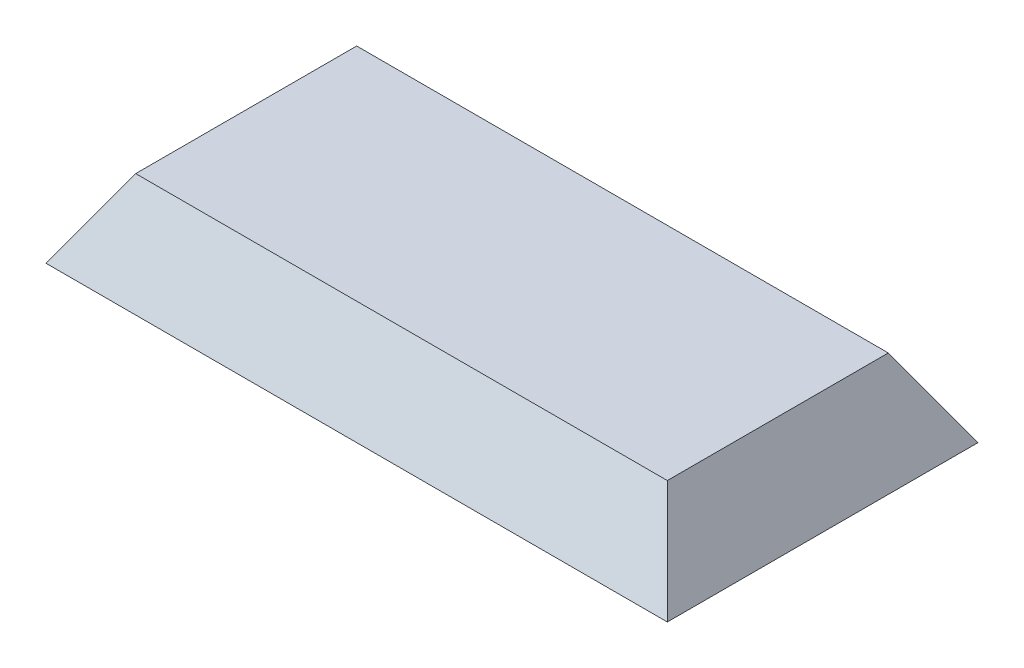
ISO-10303-21;
HEADER;
FILE_DESCRIPTION(('STEP AP214'),'2;1');
FILE_NAME('part.step','',(''),(''),'','','');
FILE_SCHEMA(('AUTOMOTIVE_DESIGN { 1 0 10303 214 1 1 1 1 }'));
ENDSEC;
DATA;
#1=APPLICATION_CONTEXT('core data for automotive mechanical design processes');
#2=APPLICATION_PROTOCOL_DEFINITION('international standard','automotive_design',2000,#1);
#3=PRODUCT_CONTEXT('',#1,'mechanical');
#4=PRODUCT('Part','Part','',(#3));
#5=PRODUCT_RELATED_PRODUCT_CATEGORY('part','',(#4));
#6=PRODUCT_DEFINITION_FORMATION('','',#4);
#7=PRODUCT_DEFINITION_CONTEXT('part definition',#1,'design');
#8=PRODUCT_DEFINITION('design','',#6,#7);
#9=PRODUCT_DEFINITION_SHAPE('','',#8);
#10=(LENGTH_UNIT() NAMED_UNIT(*) SI_UNIT(.MILLI.,.METRE.));
#11=(NAMED_UNIT(*) PLANE_ANGLE_UNIT() SI_UNIT($,.RADIAN.));
#12=(NAMED_UNIT(*) SI_UNIT($,.STERADIAN.) SOLID_ANGLE_UNIT());
#13=UNCERTAINTY_MEASURE_WITH_UNIT(LENGTH_MEASURE(1.E-05),#10,'distance_accuracy_value','');
#14=(GEOMETRIC_REPRESENTATION_CONTEXT(3) GLOBAL_UNCERTAINTY_ASSIGNED_CONTEXT((#13)) GLOBAL_UNIT_ASSIGNED_CONTEXT((#10,
#11,#12)) REPRESENTATION_CONTEXT('',''));
#15=CARTESIAN_POINT('',(0.,0.,0.));
#16=DIRECTION('',(0.,0.,1.));
#17=DIRECTION('',(1.,0.,0.));
#18=AXIS2_PLACEMENT_3D('',#15,#16,#17);
#19=CARTESIAN_POINT('',(40.,0.,20.));
#20=DIRECTION('',(0.866025403784438,0.5,0.));
#21=DIRECTION('',(-0.5,0.866025403784438,0.));
#22=AXIS2_PLACEMENT_3D('',#19,#20,#21);
#23=PLANE('',#22);
#24=DIRECTION('',(0.,0.,-1.));
#25=VECTOR('',#24,1.);
#26=CARTESIAN_POINT('',(40.,0.,20.));
#27=LINE('',#26,#25);
#28=CARTESIAN_POINT('',(40.,0.,20.));
#29=VERTEX_POINT('',#28);
#30=CARTESIAN_POINT('',(40.,0.,-20.));
#31=VERTEX_POINT('',#30);
#32=EDGE_CURVE('E79',#29,#31,#27,.T.);
#33=ORIENTED_EDGE('',*,*,#32,.T.);
#34=DIRECTION('',(0.447213595499958,-0.774596669241483,-0.447213595499958));
#35=VECTOR('',#34,1.);
#36=CARTESIAN_POINT('',(24.,27.712812921102,-3.99999999999998));
#37=LINE('',#36,#35);
#38=CARTESIAN_POINT('',(34.2264973081037,10.,-14.2264973081037));
#39=VERTEX_POINT('',#38);
#40=EDGE_CURVE('E11',#39,#31,#37,.T.);
#41=ORIENTED_EDGE('',*,*,#40,.F.);
#42=DIRECTION('',(0.,0.,1.));
#43=VECTOR('',#42,1.);
#44=CARTESIAN_POINT('',(34.2264973081037,10.,0.));
#45=LINE('',#44,#43);
#46=CARTESIAN_POINT('',(34.2264973081037,10.,14.2264973081037));
#47=VERTEX_POINT('',#46);
#48=EDGE_CURVE('E95',#47,#39,#45,.F.);
#49=ORIENTED_EDGE('',*,*,#48,.F.);
#50=DIRECTION('',(0.447213595499958,-0.774596669241483,0.447213595499958));
#51=VECTOR('',#50,1.);
#52=CARTESIAN_POINT('',(40.,0.,20.));
#53=LINE('',#52,#51);
#54=EDGE_CURVE('E90',#47,#29,#53,.T.);
#55=ORIENTED_EDGE('',*,*,#54,.T.);
#56=EDGE_LOOP('',(#33,#41,#49,#55));
#57=FACE_BOUND('',#56,.T.);
#58=ADVANCED_FACE('F33',(#57),#23,.T.);
#59=CARTESIAN_POINT('',(-40.,0.,-20.));
#60=DIRECTION('',(0.,0.5,-0.866025403784438));
#61=DIRECTION('',(0.,0.866025403784438,0.5));
#62=AXIS2_PLACEMENT_3D('',#59,#60,#61);
#63=PLANE('',#62);
#64=DIRECTION('',(-1.,0.,0.));
#65=VECTOR('',#64,1.);
#66=CARTESIAN_POINT('',(-40.,0.,-20.));
#67=LINE('',#66,#65);
#68=CARTESIAN_POINT('',(-40.,0.,-20.));
#69=VERTEX_POINT('',#68);
#70=EDGE_CURVE('E75',#31,#69,#67,.T.);
#71=ORIENTED_EDGE('',*,*,#70,.T.);
#72=DIRECTION('',(-0.447213595499958,-0.774596669241483,-0.447213595499958));
#73=VECTOR('',#72,1.);
#74=CARTESIAN_POINT('',(-32.,13.856406460551,-12.));
#75=LINE('',#74,#73);
#76=CARTESIAN_POINT('',(-34.2264973081037,10.,-14.2264973081037));
#77=VERTEX_POINT('',#76);
#78=EDGE_CURVE('E42',#77,#69,#75,.T.);
#79=ORIENTED_EDGE('',*,*,#78,.F.);
#80=DIRECTION('',(1.,0.,0.));
#81=VECTOR('',#80,1.);
#82=CARTESIAN_POINT('',(0.,10.,-14.2264973081037));
#83=LINE('',#82,#81);
#84=EDGE_CURVE('E86',#39,#77,#83,.F.);
#85=ORIENTED_EDGE('',*,*,#84,.F.);
#86=ORIENTED_EDGE('',*,*,#40,.T.);
#87=EDGE_LOOP('',(#71,#79,#85,#86));
#88=FACE_BOUND('',#87,.T.);
#89=ADVANCED_FACE('F35',(#88),#63,.T.);
#90=CARTESIAN_POINT('',(-40.,0.,20.));
#91=DIRECTION('',(-0.866025403784438,0.5,0.));
#92=DIRECTION('',(-0.5,-0.866025403784438,0.));
#93=AXIS2_PLACEMENT_3D('',#90,#91,#92);
#94=PLANE('',#93);
#95=DIRECTION('',(0.,0.,1.));
#96=VECTOR('',#95,1.);
#97=CARTESIAN_POINT('',(-40.,0.,20.));
#98=LINE('',#97,#96);
#99=CARTESIAN_POINT('',(-40.,0.,20.));
#100=VERTEX_POINT('',#99);
#101=EDGE_CURVE('E80',#69,#100,#98,.T.);
#102=ORIENTED_EDGE('',*,*,#101,.T.);
#103=DIRECTION('',(-0.447213595499958,-0.774596669241483,0.447213595499958));
#104=VECTOR('',#103,1.);
#105=CARTESIAN_POINT('',(-40.,0.,20.));
#106=LINE('',#105,#104);
#107=CARTESIAN_POINT('',(-34.2264973081037,10.,14.2264973081037));
#108=VERTEX_POINT('',#107);
#109=EDGE_CURVE('E98',#108,#100,#106,.T.);
#110=ORIENTED_EDGE('',*,*,#109,.F.);
#111=DIRECTION('',(0.,0.,-1.));
#112=VECTOR('',#111,1.);
#113=CARTESIAN_POINT('',(-34.2264973081037,10.,0.));
#114=LINE('',#113,#112);
#115=EDGE_CURVE('E54',#77,#108,#114,.F.);
#116=ORIENTED_EDGE('',*,*,#115,.F.);
#117=ORIENTED_EDGE('',*,*,#78,.T.);
#118=EDGE_LOOP('',(#102,#110,#116,#117));
#119=FACE_BOUND('',#118,.T.);
#120=ADVANCED_FACE('F105',(#119),#94,.T.);
#121=CARTESIAN_POINT('',(-40.,0.,20.));
#122=DIRECTION('',(0.,0.5,0.866025403784438));
#123=DIRECTION('',(0.,-0.866025403784438,0.5));
#124=AXIS2_PLACEMENT_3D('',#121,#122,#123);
#125=PLANE('',#124);
#126=DIRECTION('',(1.,0.,0.));
#127=VECTOR('',#126,1.);
#128=CARTESIAN_POINT('',(-40.,0.,20.));
#129=LINE('',#128,#127);
#130=EDGE_CURVE('E94',#100,#29,#129,.T.);
#131=ORIENTED_EDGE('',*,*,#130,.T.);
#132=ORIENTED_EDGE('',*,*,#54,.F.);
#133=DIRECTION('',(-1.,0.,0.));
#134=VECTOR('',#133,1.);
#135=CARTESIAN_POINT('',(0.,10.,14.2264973081037));
#136=LINE('',#135,#134);
#137=EDGE_CURVE('E37',#108,#47,#136,.F.);
#138=ORIENTED_EDGE('',*,*,#137,.F.);
#139=ORIENTED_EDGE('',*,*,#109,.T.);
#140=EDGE_LOOP('',(#131,#132,#138,#139));
#141=FACE_BOUND('',#140,.T.);
#142=ADVANCED_FACE('F107',(#141),#125,.T.);
#143=CARTESIAN_POINT('',(0.,10.,0.));
#144=DIRECTION('',(0.,-1.,0.));
#145=DIRECTION('',(0.,0.,-1.));
#146=AXIS2_PLACEMENT_3D('',#143,#144,#145);
#147=PLANE('',#146);
#148=ORIENTED_EDGE('',*,*,#48,.T.);
#149=ORIENTED_EDGE('',*,*,#84,.T.);
#150=ORIENTED_EDGE('',*,*,#115,.T.);
#151=ORIENTED_EDGE('',*,*,#137,.T.);
#152=EDGE_LOOP('',(#148,#149,#150,#151));
#153=FACE_BOUND('',#152,.T.);
#154=ADVANCED_FACE('F103',(#153),#147,.F.);
#155=CARTESIAN_POINT('',(0.,0.,0.));
#156=DIRECTION('',(0.,-1.,0.));
#157=DIRECTION('',(0.,0.,-1.));
#158=AXIS2_PLACEMENT_3D('',#155,#156,#157);
#159=PLANE('',#158);
#160=ORIENTED_EDGE('',*,*,#32,.F.);
#161=ORIENTED_EDGE('',*,*,#130,.F.);
#162=ORIENTED_EDGE('',*,*,#101,.F.);
#163=ORIENTED_EDGE('',*,*,#70,.F.);
#164=EDGE_LOOP('',(#160,#161,#162,#163));
#165=FACE_BOUND('',#164,.T.);
#166=ADVANCED_FACE('F76',(#165),#159,.T.);
#167=CLOSED_SHELL('',(#58,#89,#120,#142,#154,#166));
#168=MANIFOLD_SOLID_BREP('B2',#167);
#169=ADVANCED_BREP_SHAPE_REPRESENTATION('',(#18,#168),#14);
#170=SHAPE_DEFINITION_REPRESENTATION(#9,#169);
ENDSEC;
END-ISO-10303-21;
